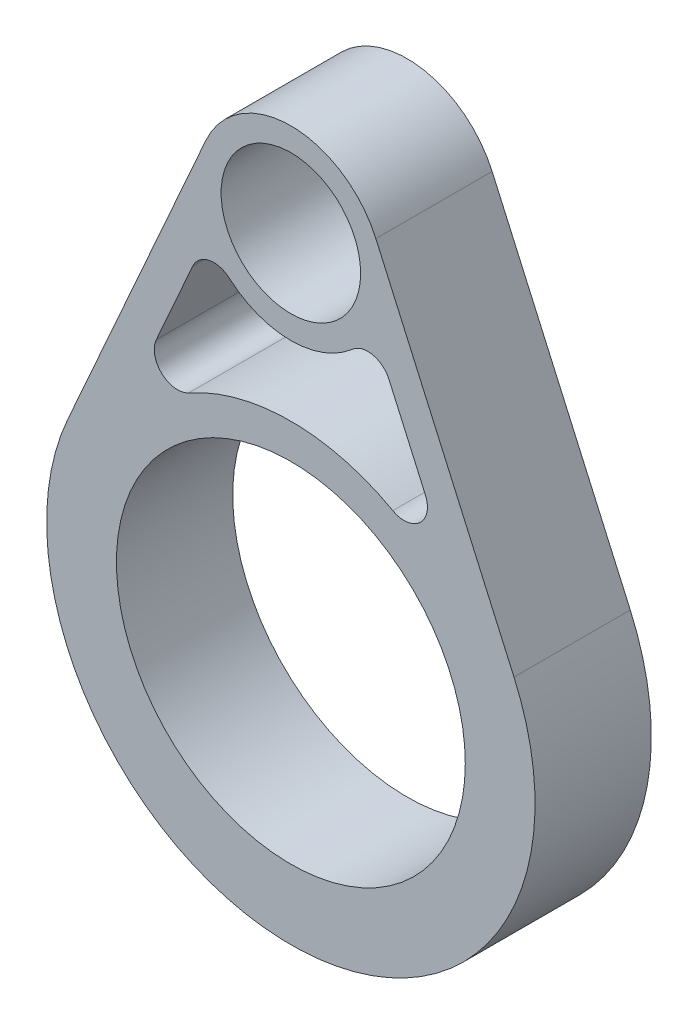
ISO-10303-21;
HEADER;
FILE_DESCRIPTION(('STEP AP214'),'2;1');
FILE_NAME('part.step','',(''),(''),'','','');
FILE_SCHEMA(('AUTOMOTIVE_DESIGN { 1 0 10303 214 1 1 1 1 }'));
ENDSEC;
DATA;
#1=APPLICATION_CONTEXT('core data for automotive mechanical design processes');
#2=APPLICATION_PROTOCOL_DEFINITION('international standard','automotive_design',2000,#1);
#3=PRODUCT_CONTEXT('',#1,'mechanical');
#4=PRODUCT('Part','Part','',(#3));
#5=PRODUCT_RELATED_PRODUCT_CATEGORY('part','',(#4));
#6=PRODUCT_DEFINITION_FORMATION('','',#4);
#7=PRODUCT_DEFINITION_CONTEXT('part definition',#1,'design');
#8=PRODUCT_DEFINITION('design','',#6,#7);
#9=PRODUCT_DEFINITION_SHAPE('','',#8);
#10=(LENGTH_UNIT() NAMED_UNIT(*) SI_UNIT(.MILLI.,.METRE.));
#11=(NAMED_UNIT(*) PLANE_ANGLE_UNIT() SI_UNIT($,.RADIAN.));
#12=(NAMED_UNIT(*) SI_UNIT($,.STERADIAN.) SOLID_ANGLE_UNIT());
#13=UNCERTAINTY_MEASURE_WITH_UNIT(LENGTH_MEASURE(1.E-05),#10,'distance_accuracy_value','');
#14=(GEOMETRIC_REPRESENTATION_CONTEXT(3) GLOBAL_UNCERTAINTY_ASSIGNED_CONTEXT((#13)) GLOBAL_UNIT_ASSIGNED_CONTEXT((#10,
#11,#12)) REPRESENTATION_CONTEXT('',''));
#15=CARTESIAN_POINT('',(0.,0.,0.));
#16=DIRECTION('',(0.,0.,1.));
#17=DIRECTION('',(1.,0.,0.));
#18=AXIS2_PLACEMENT_3D('',#15,#16,#17);
#19=CARTESIAN_POINT('',(0.,-160.,25.));
#20=DIRECTION('',(0.,0.,1.));
#21=DIRECTION('',(1.,0.,0.));
#22=AXIS2_PLACEMENT_3D('',#19,#20,#21);
#23=PLANE('',#22);
#24=CARTESIAN_POINT('',(0.,0.,25.));
#25=DIRECTION('',(0.,0.,1.));
#26=DIRECTION('',(1.,0.,0.));
#27=AXIS2_PLACEMENT_3D('',#24,#25,#26);
#28=CIRCLE('',#27,30.);
#29=CARTESIAN_POINT('',(30.,0.,25.));
#30=VERTEX_POINT('',#29);
#31=EDGE_CURVE('E285',#30,#30,#28,.T.);
#32=ORIENTED_EDGE('',*,*,#31,.F.);
#33=EDGE_LOOP('',(#32));
#34=FACE_BOUND('',#33,.T.);
#35=CARTESIAN_POINT('',(0.,0.,25.));
#36=DIRECTION('',(0.,0.,-1.));
#37=DIRECTION('',(1.,0.,0.));
#38=AXIS2_PLACEMENT_3D('',#35,#36,#37);
#39=CIRCLE('',#38,40.);
#40=CARTESIAN_POINT('',(26.4666556609354,-29.9919345512335,25.));
#41=VERTEX_POINT('',#40);
#42=CARTESIAN_POINT('',(-26.4666556609355,-29.9919345512335,25.));
#43=VERTEX_POINT('',#42);
#44=EDGE_CURVE('E192',#41,#43,#39,.T.);
#45=ORIENTED_EDGE('',*,*,#44,.F.);
#46=CARTESIAN_POINT('',(33.0833195761693,-37.4899181890419,25.));
#47=DIRECTION('',(0.,0.,1.));
#48=DIRECTION('',(1.,0.,0.));
#49=AXIS2_PLACEMENT_3D('',#46,#47,#48);
#50=CIRCLE('',#49,10.);
#51=CARTESIAN_POINT('',(42.2209392744277,-33.4274181890419,25.));
#52=VERTEX_POINT('',#51);
#53=EDGE_CURVE('E176',#41,#52,#50,.F.);
#54=ORIENTED_EDGE('',*,*,#53,.T.);
#55=DIRECTION('',(-0.40625,0.91376196982584,0.));
#56=VECTOR('',#55,1.);
#57=CARTESIAN_POINT('',(82.2385772843257,-123.4375,25.));
#58=LINE('',#57,#56);
#59=CARTESIAN_POINT('',(57.8635772843256,-68.6117818104496,25.));
#60=VERTEX_POINT('',#59);
#61=EDGE_CURVE('E292',#60,#52,#58,.T.);
#62=ORIENTED_EDGE('',*,*,#61,.F.);
#63=CARTESIAN_POINT('',(48.7259575860672,-72.6742818104496,25.));
#64=DIRECTION('',(0.,0.,1.));
#65=DIRECTION('',(1.,0.,0.));
#66=AXIS2_PLACEMENT_3D('',#63,#64,#65);
#67=CIRCLE('',#66,10.);
#68=CARTESIAN_POINT('',(43.8533618274605,-81.4068536294046,25.));
#69=VERTEX_POINT('',#68);
#70=EDGE_CURVE('E49',#60,#69,#67,.F.);
#71=ORIENTED_EDGE('',*,*,#70,.T.);
#72=CARTESIAN_POINT('',(0.,-160.,25.));
#73=DIRECTION('',(0.,0.,-1.));
#74=DIRECTION('',(1.,0.,0.));
#75=AXIS2_PLACEMENT_3D('',#72,#73,#74);
#76=CIRCLE('',#75,90.);
#77=CARTESIAN_POINT('',(-43.8533618274605,-81.4068536294046,25.));
#78=VERTEX_POINT('',#77);
#79=EDGE_CURVE('E186',#78,#69,#76,.T.);
#80=ORIENTED_EDGE('',*,*,#79,.F.);
#81=CARTESIAN_POINT('',(-48.7259575860672,-72.6742818104496,25.));
#82=DIRECTION('',(0.,0.,1.));
#83=DIRECTION('',(1.,0.,0.));
#84=AXIS2_PLACEMENT_3D('',#81,#82,#83);
#85=CIRCLE('',#84,10.);
#86=CARTESIAN_POINT('',(-57.8635772843256,-68.6117818104496,25.));
#87=VERTEX_POINT('',#86);
#88=EDGE_CURVE('E42',#78,#87,#85,.F.);
#89=ORIENTED_EDGE('',*,*,#88,.T.);
#90=DIRECTION('',(-0.40625,-0.91376196982584,0.));
#91=VECTOR('',#90,1.);
#92=CARTESIAN_POINT('',(-35.5292014298928,-18.3759583628748,25.));
#93=LINE('',#92,#91);
#94=CARTESIAN_POINT('',(-42.2209392744277,-33.4274181890419,25.));
#95=VERTEX_POINT('',#94);
#96=EDGE_CURVE('E185',#95,#87,#93,.T.);
#97=ORIENTED_EDGE('',*,*,#96,.F.);
#98=CARTESIAN_POINT('',(-33.0833195761693,-37.4899181890419,25.));
#99=DIRECTION('',(0.,0.,1.));
#100=DIRECTION('',(1.,0.,0.));
#101=AXIS2_PLACEMENT_3D('',#98,#99,#100);
#102=CIRCLE('',#101,10.);
#103=EDGE_CURVE('E172',#95,#43,#102,.F.);
#104=ORIENTED_EDGE('',*,*,#103,.T.);
#105=EDGE_LOOP('',(#45,#54,#62,#71,#80,#89,#97,#104));
#106=FACE_BOUND('',#105,.T.);
#107=CARTESIAN_POINT('',(0.,-160.,25.));
#108=DIRECTION('',(0.,0.,1.));
#109=DIRECTION('',(1.,0.,0.));
#110=AXIS2_PLACEMENT_3D('',#107,#108,#109);
#111=CIRCLE('',#110,105.);
#112=CARTESIAN_POINT('',(-95.9450068317132,-117.34375,25.));
#113=VERTEX_POINT('',#112);
#114=CARTESIAN_POINT('',(95.9450068317133,-117.34375,25.));
#115=VERTEX_POINT('',#114);
#116=EDGE_CURVE('E134',#113,#115,#111,.T.);
#117=ORIENTED_EDGE('',*,*,#116,.T.);
#118=DIRECTION('',(-0.40625,0.91376196982584,0.));
#119=VECTOR('',#118,1.);
#120=CARTESIAN_POINT('',(36.5504787930336,16.25,25.));
#121=LINE('',#120,#119);
#122=CARTESIAN_POINT('',(36.5504787930336,16.25,25.));
#123=VERTEX_POINT('',#122);
#124=EDGE_CURVE('E123',#115,#123,#121,.T.);
#125=ORIENTED_EDGE('',*,*,#124,.T.);
#126=CARTESIAN_POINT('',(0.,0.,25.));
#127=DIRECTION('',(0.,0.,1.));
#128=DIRECTION('',(1.,0.,0.));
#129=AXIS2_PLACEMENT_3D('',#126,#127,#128);
#130=CIRCLE('',#129,40.);
#131=CARTESIAN_POINT('',(-36.5504787930336,16.25,25.));
#132=VERTEX_POINT('',#131);
#133=EDGE_CURVE('E133',#123,#132,#130,.T.);
#134=ORIENTED_EDGE('',*,*,#133,.T.);
#135=DIRECTION('',(-0.40625,-0.91376196982584,0.));
#136=VECTOR('',#135,1.);
#137=CARTESIAN_POINT('',(-95.9450068317132,-117.34375,25.));
#138=LINE('',#137,#136);
#139=EDGE_CURVE('E139',#132,#113,#138,.T.);
#140=ORIENTED_EDGE('',*,*,#139,.T.);
#141=EDGE_LOOP('',(#117,#125,#134,#140));
#142=FACE_BOUND('',#141,.T.);
#143=CARTESIAN_POINT('',(0.,-160.,25.));
#144=DIRECTION('',(0.,0.,1.));
#145=DIRECTION('',(1.,0.,0.));
#146=AXIS2_PLACEMENT_3D('',#143,#144,#145);
#147=CIRCLE('',#146,75.);
#148=CARTESIAN_POINT('',(75.,-160.,25.));
#149=VERTEX_POINT('',#148);
#150=EDGE_CURVE('E215',#149,#149,#147,.T.);
#151=ORIENTED_EDGE('',*,*,#150,.F.);
#152=EDGE_LOOP('',(#151));
#153=FACE_BOUND('',#152,.T.);
#154=ADVANCED_FACE('F34',(#34,#106,#142,#153),#23,.T.);
#155=CARTESIAN_POINT('',(0.,-160.,-25.));
#156=DIRECTION('',(0.,0.,1.));
#157=DIRECTION('',(1.,0.,0.));
#158=AXIS2_PLACEMENT_3D('',#155,#156,#157);
#159=PLANE('',#158);
#160=CARTESIAN_POINT('',(0.,0.,-25.));
#161=DIRECTION('',(0.,0.,1.));
#162=DIRECTION('',(1.,0.,0.));
#163=AXIS2_PLACEMENT_3D('',#160,#161,#162);
#164=CIRCLE('',#163,30.);
#165=CARTESIAN_POINT('',(30.,0.,-25.));
#166=VERTEX_POINT('',#165);
#167=EDGE_CURVE('E283',#166,#166,#164,.T.);
#168=ORIENTED_EDGE('',*,*,#167,.T.);
#169=EDGE_LOOP('',(#168));
#170=FACE_BOUND('',#169,.T.);
#171=CARTESIAN_POINT('',(0.,-160.,-25.));
#172=DIRECTION('',(0.,0.,-1.));
#173=DIRECTION('',(1.,0.,0.));
#174=AXIS2_PLACEMENT_3D('',#171,#172,#173);
#175=CIRCLE('',#174,90.);
#176=CARTESIAN_POINT('',(-43.8533618274605,-81.4068536294046,-25.));
#177=VERTEX_POINT('',#176);
#178=CARTESIAN_POINT('',(43.8533618274605,-81.4068536294046,-25.));
#179=VERTEX_POINT('',#178);
#180=EDGE_CURVE('E200',#177,#179,#175,.T.);
#181=ORIENTED_EDGE('',*,*,#180,.T.);
#182=CARTESIAN_POINT('',(48.7259575860672,-72.6742818104496,-25.));
#183=DIRECTION('',(0.,0.,1.));
#184=DIRECTION('',(1.,0.,0.));
#185=AXIS2_PLACEMENT_3D('',#182,#183,#184);
#186=CIRCLE('',#185,10.);
#187=CARTESIAN_POINT('',(57.8635772843256,-68.6117818104496,-25.));
#188=VERTEX_POINT('',#187);
#189=EDGE_CURVE('E181',#179,#188,#186,.T.);
#190=ORIENTED_EDGE('',*,*,#189,.T.);
#191=DIRECTION('',(-0.40625,0.91376196982584,0.));
#192=VECTOR('',#191,1.);
#193=CARTESIAN_POINT('',(82.2385772843257,-123.4375,-25.));
#194=LINE('',#193,#192);
#195=CARTESIAN_POINT('',(42.2209392744277,-33.4274181890419,-25.));
#196=VERTEX_POINT('',#195);
#197=EDGE_CURVE('E206',#188,#196,#194,.T.);
#198=ORIENTED_EDGE('',*,*,#197,.T.);
#199=CARTESIAN_POINT('',(33.0833195761693,-37.4899181890419,-25.));
#200=DIRECTION('',(0.,0.,1.));
#201=DIRECTION('',(1.,0.,0.));
#202=AXIS2_PLACEMENT_3D('',#199,#200,#201);
#203=CIRCLE('',#202,10.);
#204=CARTESIAN_POINT('',(26.4666556609354,-29.9919345512335,-25.));
#205=VERTEX_POINT('',#204);
#206=EDGE_CURVE('E178',#196,#205,#203,.T.);
#207=ORIENTED_EDGE('',*,*,#206,.T.);
#208=CARTESIAN_POINT('',(0.,0.,-25.));
#209=DIRECTION('',(0.,0.,-1.));
#210=DIRECTION('',(1.,0.,0.));
#211=AXIS2_PLACEMENT_3D('',#208,#209,#210);
#212=CIRCLE('',#211,40.);
#213=CARTESIAN_POINT('',(-26.4666556609355,-29.9919345512335,-25.));
#214=VERTEX_POINT('',#213);
#215=EDGE_CURVE('E211',#205,#214,#212,.T.);
#216=ORIENTED_EDGE('',*,*,#215,.T.);
#217=CARTESIAN_POINT('',(-33.0833195761693,-37.4899181890419,-25.));
#218=DIRECTION('',(0.,0.,1.));
#219=DIRECTION('',(1.,0.,0.));
#220=AXIS2_PLACEMENT_3D('',#217,#218,#219);
#221=CIRCLE('',#220,10.);
#222=CARTESIAN_POINT('',(-42.2209392744277,-33.4274181890419,-25.));
#223=VERTEX_POINT('',#222);
#224=EDGE_CURVE('E174',#214,#223,#221,.T.);
#225=ORIENTED_EDGE('',*,*,#224,.T.);
#226=DIRECTION('',(-0.40625,-0.91376196982584,0.));
#227=VECTOR('',#226,1.);
#228=CARTESIAN_POINT('',(-35.5292014298928,-18.3759583628748,-25.));
#229=LINE('',#228,#227);
#230=CARTESIAN_POINT('',(-57.8635772843256,-68.6117818104496,-25.));
#231=VERTEX_POINT('',#230);
#232=EDGE_CURVE('E202',#223,#231,#229,.T.);
#233=ORIENTED_EDGE('',*,*,#232,.T.);
#234=CARTESIAN_POINT('',(-48.7259575860672,-72.6742818104496,-25.));
#235=DIRECTION('',(0.,0.,1.));
#236=DIRECTION('',(1.,0.,0.));
#237=AXIS2_PLACEMENT_3D('',#234,#235,#236);
#238=CIRCLE('',#237,10.);
#239=EDGE_CURVE('E11',#231,#177,#238,.T.);
#240=ORIENTED_EDGE('',*,*,#239,.T.);
#241=EDGE_LOOP('',(#181,#190,#198,#207,#216,#225,#233,#240));
#242=FACE_BOUND('',#241,.T.);
#243=CARTESIAN_POINT('',(0.,-160.,-25.));
#244=DIRECTION('',(0.,0.,1.));
#245=DIRECTION('',(1.,0.,0.));
#246=AXIS2_PLACEMENT_3D('',#243,#244,#245);
#247=CIRCLE('',#246,105.);
#248=CARTESIAN_POINT('',(-95.9450068317132,-117.34375,-25.));
#249=VERTEX_POINT('',#248);
#250=CARTESIAN_POINT('',(95.9450068317133,-117.34375,-25.));
#251=VERTEX_POINT('',#250);
#252=EDGE_CURVE('E147',#249,#251,#247,.T.);
#253=ORIENTED_EDGE('',*,*,#252,.F.);
#254=DIRECTION('',(-0.40625,-0.91376196982584,0.));
#255=VECTOR('',#254,1.);
#256=CARTESIAN_POINT('',(-95.9450068317132,-117.34375,-25.));
#257=LINE('',#256,#255);
#258=CARTESIAN_POINT('',(-36.5504787930336,16.25,-25.));
#259=VERTEX_POINT('',#258);
#260=EDGE_CURVE('E143',#259,#249,#257,.T.);
#261=ORIENTED_EDGE('',*,*,#260,.F.);
#262=CARTESIAN_POINT('',(0.,0.,-25.));
#263=DIRECTION('',(0.,0.,1.));
#264=DIRECTION('',(1.,0.,0.));
#265=AXIS2_PLACEMENT_3D('',#262,#263,#264);
#266=CIRCLE('',#265,40.);
#267=CARTESIAN_POINT('',(36.5504787930336,16.25,-25.));
#268=VERTEX_POINT('',#267);
#269=EDGE_CURVE('E226',#268,#259,#266,.T.);
#270=ORIENTED_EDGE('',*,*,#269,.F.);
#271=DIRECTION('',(-0.40625,0.91376196982584,0.));
#272=VECTOR('',#271,1.);
#273=CARTESIAN_POINT('',(36.5504787930336,16.25,-25.));
#274=LINE('',#273,#272);
#275=EDGE_CURVE('E224',#251,#268,#274,.T.);
#276=ORIENTED_EDGE('',*,*,#275,.F.);
#277=EDGE_LOOP('',(#253,#261,#270,#276));
#278=FACE_BOUND('',#277,.T.);
#279=CARTESIAN_POINT('',(0.,-160.,-25.));
#280=DIRECTION('',(0.,0.,1.));
#281=DIRECTION('',(1.,0.,0.));
#282=AXIS2_PLACEMENT_3D('',#279,#280,#281);
#283=CIRCLE('',#282,75.);
#284=CARTESIAN_POINT('',(75.,-160.,-25.));
#285=VERTEX_POINT('',#284);
#286=EDGE_CURVE('E209',#285,#285,#283,.T.);
#287=ORIENTED_EDGE('',*,*,#286,.T.);
#288=EDGE_LOOP('',(#287));
#289=FACE_BOUND('',#288,.T.);
#290=ADVANCED_FACE('F198',(#170,#242,#278,#289),#159,.F.);
#291=CARTESIAN_POINT('',(0.,-160.,25.));
#292=DIRECTION('',(0.,0.,-1.));
#293=DIRECTION('',(-1.,0.,0.));
#294=AXIS2_PLACEMENT_3D('',#291,#292,#293);
#295=CYLINDRICAL_SURFACE('',#294,105.);
#296=ORIENTED_EDGE('',*,*,#252,.T.);
#297=DIRECTION('',(0.,0.,-1.));
#298=VECTOR('',#297,1.);
#299=CARTESIAN_POINT('',(95.9450068317133,-117.34375,25.));
#300=LINE('',#299,#298);
#301=EDGE_CURVE('E127',#115,#251,#300,.T.);
#302=ORIENTED_EDGE('',*,*,#301,.F.);
#303=ORIENTED_EDGE('',*,*,#116,.F.);
#304=DIRECTION('',(0.,0.,-1.));
#305=VECTOR('',#304,1.);
#306=CARTESIAN_POINT('',(-95.9450068317132,-117.34375,25.));
#307=LINE('',#306,#305);
#308=EDGE_CURVE('E222',#113,#249,#307,.T.);
#309=ORIENTED_EDGE('',*,*,#308,.T.);
#310=EDGE_LOOP('',(#296,#302,#303,#309));
#311=FACE_BOUND('',#310,.T.);
#312=ADVANCED_FACE('F145',(#311),#295,.T.);
#313=CARTESIAN_POINT('',(36.5504787930336,16.25,25.));
#314=DIRECTION('',(-0.91376196982584,-0.40625,0.));
#315=DIRECTION('',(0.40625,-0.91376196982584,0.));
#316=AXIS2_PLACEMENT_3D('',#313,#314,#315);
#317=PLANE('',#316);
#318=ORIENTED_EDGE('',*,*,#275,.T.);
#319=DIRECTION('',(0.,0.,-1.));
#320=VECTOR('',#319,1.);
#321=CARTESIAN_POINT('',(36.5504787930336,16.25,25.));
#322=LINE('',#321,#320);
#323=EDGE_CURVE('E130',#123,#268,#322,.T.);
#324=ORIENTED_EDGE('',*,*,#323,.F.);
#325=ORIENTED_EDGE('',*,*,#124,.F.);
#326=ORIENTED_EDGE('',*,*,#301,.T.);
#327=EDGE_LOOP('',(#318,#324,#325,#326));
#328=FACE_BOUND('',#327,.T.);
#329=ADVANCED_FACE('F125',(#328),#317,.F.);
#330=CARTESIAN_POINT('',(0.,0.,25.));
#331=DIRECTION('',(0.,0.,-1.));
#332=DIRECTION('',(-1.,0.,0.));
#333=AXIS2_PLACEMENT_3D('',#330,#331,#332);
#334=CYLINDRICAL_SURFACE('',#333,40.);
#335=ORIENTED_EDGE('',*,*,#269,.T.);
#336=DIRECTION('',(0.,0.,-1.));
#337=VECTOR('',#336,1.);
#338=CARTESIAN_POINT('',(-36.5504787930336,16.25,25.));
#339=LINE('',#338,#337);
#340=EDGE_CURVE('E152',#132,#259,#339,.T.);
#341=ORIENTED_EDGE('',*,*,#340,.F.);
#342=ORIENTED_EDGE('',*,*,#133,.F.);
#343=ORIENTED_EDGE('',*,*,#323,.T.);
#344=EDGE_LOOP('',(#335,#341,#342,#343));
#345=FACE_BOUND('',#344,.T.);
#346=ADVANCED_FACE('F237',(#345),#334,.T.);
#347=CARTESIAN_POINT('',(-95.9450068317132,-117.34375,25.));
#348=DIRECTION('',(0.91376196982584,-0.40625,0.));
#349=DIRECTION('',(0.40625,0.91376196982584,0.));
#350=AXIS2_PLACEMENT_3D('',#347,#348,#349);
#351=PLANE('',#350);
#352=ORIENTED_EDGE('',*,*,#260,.T.);
#353=ORIENTED_EDGE('',*,*,#308,.F.);
#354=ORIENTED_EDGE('',*,*,#139,.F.);
#355=ORIENTED_EDGE('',*,*,#340,.T.);
#356=EDGE_LOOP('',(#352,#353,#354,#355));
#357=FACE_BOUND('',#356,.T.);
#358=ADVANCED_FACE('F233',(#357),#351,.F.);
#359=CARTESIAN_POINT('',(0.,-160.,25.));
#360=DIRECTION('',(0.,0.,-1.));
#361=DIRECTION('',(-1.,0.,0.));
#362=AXIS2_PLACEMENT_3D('',#359,#360,#361);
#363=CYLINDRICAL_SURFACE('',#362,75.);
#364=ORIENTED_EDGE('',*,*,#150,.T.);
#365=EDGE_LOOP('',(#364));
#366=FACE_BOUND('',#365,.T.);
#367=ORIENTED_EDGE('',*,*,#286,.F.);
#368=EDGE_LOOP('',(#367));
#369=FACE_BOUND('',#368,.T.);
#370=ADVANCED_FACE('F244',(#366,#369),#363,.F.);
#371=CARTESIAN_POINT('',(0.,0.,-25.));
#372=DIRECTION('',(0.,0.,1.));
#373=DIRECTION('',(1.,0.,0.));
#374=AXIS2_PLACEMENT_3D('',#371,#372,#373);
#375=CYLINDRICAL_SURFACE('',#374,40.);
#376=ORIENTED_EDGE('',*,*,#44,.T.);
#377=DIRECTION('',(0.,0.,1.));
#378=VECTOR('',#377,1.);
#379=CARTESIAN_POINT('',(-26.4666556609355,-29.9919345512335,-25.));
#380=LINE('',#379,#378);
#381=EDGE_CURVE('E161',#43,#214,#380,.F.);
#382=ORIENTED_EDGE('',*,*,#381,.T.);
#383=ORIENTED_EDGE('',*,*,#215,.F.);
#384=DIRECTION('',(0.,0.,1.));
#385=VECTOR('',#384,1.);
#386=CARTESIAN_POINT('',(26.4666556609354,-29.9919345512335,-25.));
#387=LINE('',#386,#385);
#388=EDGE_CURVE('E158',#205,#41,#387,.T.);
#389=ORIENTED_EDGE('',*,*,#388,.T.);
#390=EDGE_LOOP('',(#376,#382,#383,#389));
#391=FACE_BOUND('',#390,.T.);
#392=ADVANCED_FACE('F259',(#391),#375,.T.);
#393=CARTESIAN_POINT('',(82.2385772843257,-123.4375,-25.));
#394=DIRECTION('',(0.91376196982584,0.40625,0.));
#395=DIRECTION('',(-0.40625,0.91376196982584,0.));
#396=AXIS2_PLACEMENT_3D('',#393,#394,#395);
#397=PLANE('',#396);
#398=ORIENTED_EDGE('',*,*,#61,.T.);
#399=DIRECTION('',(0.,0.,-1.));
#400=VECTOR('',#399,1.);
#401=CARTESIAN_POINT('',(42.2209392744277,-33.4274181890419,-25.));
#402=LINE('',#401,#400);
#403=EDGE_CURVE('E166',#52,#196,#402,.T.);
#404=ORIENTED_EDGE('',*,*,#403,.T.);
#405=ORIENTED_EDGE('',*,*,#197,.F.);
#406=DIRECTION('',(0.,0.,-1.));
#407=VECTOR('',#406,1.);
#408=CARTESIAN_POINT('',(57.8635772843256,-68.6117818104496,25.));
#409=LINE('',#408,#407);
#410=EDGE_CURVE('E163',#188,#60,#409,.F.);
#411=ORIENTED_EDGE('',*,*,#410,.T.);
#412=EDGE_LOOP('',(#398,#404,#405,#411));
#413=FACE_BOUND('',#412,.T.);
#414=ADVANCED_FACE('F263',(#413),#397,.F.);
#415=CARTESIAN_POINT('',(0.,-160.,-25.));
#416=DIRECTION('',(0.,0.,1.));
#417=DIRECTION('',(1.,0.,0.));
#418=AXIS2_PLACEMENT_3D('',#415,#416,#417);
#419=CYLINDRICAL_SURFACE('',#418,90.);
#420=ORIENTED_EDGE('',*,*,#79,.T.);
#421=DIRECTION('',(0.,0.,1.));
#422=VECTOR('',#421,1.);
#423=CARTESIAN_POINT('',(43.8533618274605,-81.4068536294046,-25.));
#424=LINE('',#423,#422);
#425=EDGE_CURVE('E170',#69,#179,#424,.F.);
#426=ORIENTED_EDGE('',*,*,#425,.T.);
#427=ORIENTED_EDGE('',*,*,#180,.F.);
#428=DIRECTION('',(0.,0.,1.));
#429=VECTOR('',#428,1.);
#430=CARTESIAN_POINT('',(-43.8533618274605,-81.4068536294046,-25.));
#431=LINE('',#430,#429);
#432=EDGE_CURVE('E168',#177,#78,#431,.T.);
#433=ORIENTED_EDGE('',*,*,#432,.T.);
#434=EDGE_LOOP('',(#420,#426,#427,#433));
#435=FACE_BOUND('',#434,.T.);
#436=ADVANCED_FACE('F204',(#435),#419,.T.);
#437=CARTESIAN_POINT('',(-35.5292014298928,-18.3759583628748,-25.));
#438=DIRECTION('',(-0.91376196982584,0.40625,0.));
#439=DIRECTION('',(-0.40625,-0.91376196982584,0.));
#440=AXIS2_PLACEMENT_3D('',#437,#438,#439);
#441=PLANE('',#440);
#442=ORIENTED_EDGE('',*,*,#232,.F.);
#443=DIRECTION('',(0.,0.,-1.));
#444=VECTOR('',#443,1.);
#445=CARTESIAN_POINT('',(-42.2209392744277,-33.4274181890419,25.));
#446=LINE('',#445,#444);
#447=EDGE_CURVE('E150',#223,#95,#446,.F.);
#448=ORIENTED_EDGE('',*,*,#447,.T.);
#449=ORIENTED_EDGE('',*,*,#96,.T.);
#450=DIRECTION('',(0.,0.,-1.));
#451=VECTOR('',#450,1.);
#452=CARTESIAN_POINT('',(-57.8635772843256,-68.6117818104496,-25.));
#453=LINE('',#452,#451);
#454=EDGE_CURVE('E148',#87,#231,#453,.T.);
#455=ORIENTED_EDGE('',*,*,#454,.T.);
#456=EDGE_LOOP('',(#442,#448,#449,#455));
#457=FACE_BOUND('',#456,.T.);
#458=ADVANCED_FACE('F189',(#457),#441,.F.);
#459=CARTESIAN_POINT('',(-33.0833195761693,-37.4899181890419,-25.));
#460=DIRECTION('',(0.,0.,1.));
#461=DIRECTION('',(1.,0.,0.));
#462=AXIS2_PLACEMENT_3D('',#459,#460,#461);
#463=CYLINDRICAL_SURFACE('',#462,10.);
#464=ORIENTED_EDGE('',*,*,#224,.F.);
#465=ORIENTED_EDGE('',*,*,#381,.F.);
#466=ORIENTED_EDGE('',*,*,#103,.F.);
#467=ORIENTED_EDGE('',*,*,#447,.F.);
#468=EDGE_LOOP('',(#464,#465,#466,#467));
#469=FACE_BOUND('',#468,.T.);
#470=ADVANCED_FACE('F267',(#469),#463,.F.);
#471=CARTESIAN_POINT('',(33.0833195761693,-37.4899181890419,-25.));
#472=DIRECTION('',(0.,0.,1.));
#473=DIRECTION('',(1.,0.,0.));
#474=AXIS2_PLACEMENT_3D('',#471,#472,#473);
#475=CYLINDRICAL_SURFACE('',#474,10.);
#476=ORIENTED_EDGE('',*,*,#206,.F.);
#477=ORIENTED_EDGE('',*,*,#403,.F.);
#478=ORIENTED_EDGE('',*,*,#53,.F.);
#479=ORIENTED_EDGE('',*,*,#388,.F.);
#480=EDGE_LOOP('',(#476,#477,#478,#479));
#481=FACE_BOUND('',#480,.T.);
#482=ADVANCED_FACE('F302',(#481),#475,.F.);
#483=CARTESIAN_POINT('',(48.7259575860672,-72.6742818104496,-25.));
#484=DIRECTION('',(0.,0.,1.));
#485=DIRECTION('',(1.,0.,0.));
#486=AXIS2_PLACEMENT_3D('',#483,#484,#485);
#487=CYLINDRICAL_SURFACE('',#486,10.);
#488=ORIENTED_EDGE('',*,*,#189,.F.);
#489=ORIENTED_EDGE('',*,*,#425,.F.);
#490=ORIENTED_EDGE('',*,*,#70,.F.);
#491=ORIENTED_EDGE('',*,*,#410,.F.);
#492=EDGE_LOOP('',(#488,#489,#490,#491));
#493=FACE_BOUND('',#492,.T.);
#494=ADVANCED_FACE('F279',(#493),#487,.F.);
#495=CARTESIAN_POINT('',(-48.7259575860672,-72.6742818104496,-25.));
#496=DIRECTION('',(0.,0.,1.));
#497=DIRECTION('',(1.,0.,0.));
#498=AXIS2_PLACEMENT_3D('',#495,#496,#497);
#499=CYLINDRICAL_SURFACE('',#498,10.);
#500=ORIENTED_EDGE('',*,*,#239,.F.);
#501=ORIENTED_EDGE('',*,*,#454,.F.);
#502=ORIENTED_EDGE('',*,*,#88,.F.);
#503=ORIENTED_EDGE('',*,*,#432,.F.);
#504=EDGE_LOOP('',(#500,#501,#502,#503));
#505=FACE_BOUND('',#504,.T.);
#506=ADVANCED_FACE('F36',(#505),#499,.F.);
#507=CARTESIAN_POINT('',(0.,0.,-25.));
#508=DIRECTION('',(0.,0.,1.));
#509=DIRECTION('',(1.,0.,0.));
#510=AXIS2_PLACEMENT_3D('',#507,#508,#509);
#511=CYLINDRICAL_SURFACE('',#510,30.);
#512=ORIENTED_EDGE('',*,*,#167,.F.);
#513=EDGE_LOOP('',(#512));
#514=FACE_BOUND('',#513,.T.);
#515=ORIENTED_EDGE('',*,*,#31,.T.);
#516=EDGE_LOOP('',(#515));
#517=FACE_BOUND('',#516,.T.);
#518=ADVANCED_FACE('F273',(#514,#517),#511,.F.);
#519=CLOSED_SHELL('',(#154,#290,#312,#329,#346,#358,#370,#392,#414,#436,#458,#470,#482,#494,
#506,#518));
#520=MANIFOLD_SOLID_BREP('B2',#519);
#521=ADVANCED_BREP_SHAPE_REPRESENTATION('',(#18,#520),#14);
#522=SHAPE_DEFINITION_REPRESENTATION(#9,#521);
ENDSEC;
END-ISO-10303-21;
